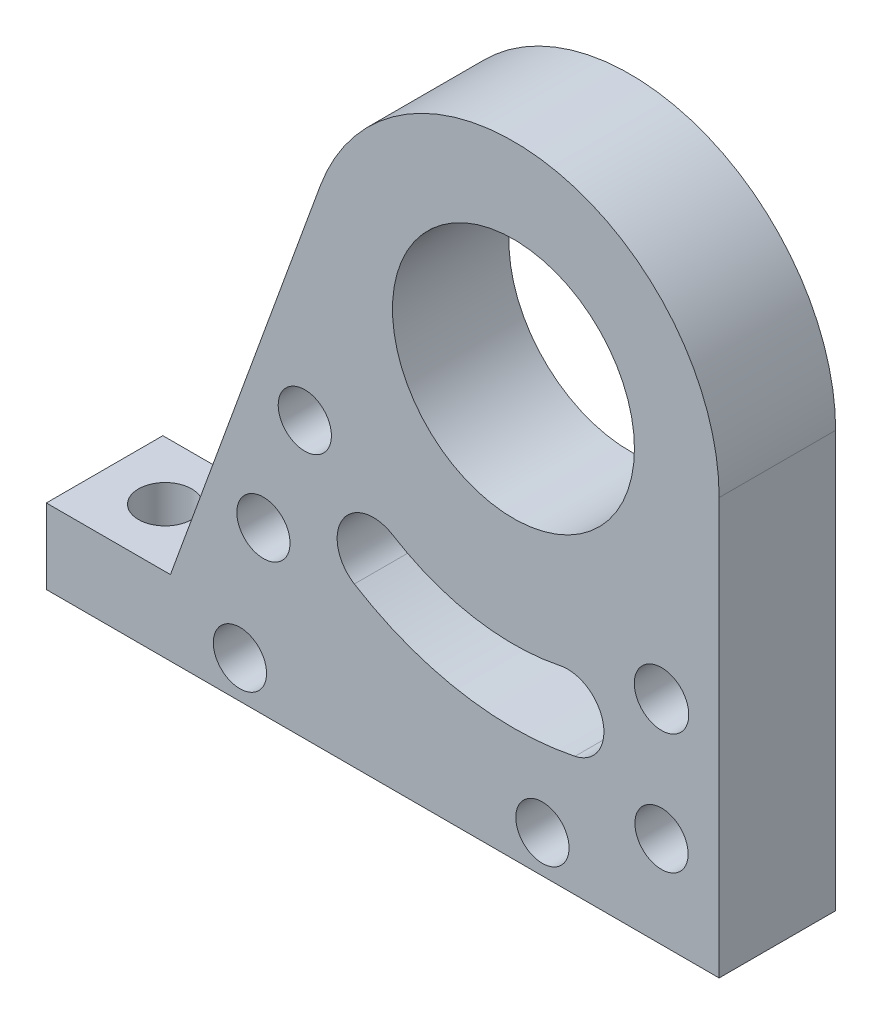
ISO-10303-21;
HEADER;
FILE_DESCRIPTION(('STEP AP214'),'2;1');
FILE_NAME('part.step','',(''),(''),'','','');
FILE_SCHEMA(('AUTOMOTIVE_DESIGN { 1 0 10303 214 1 1 1 1 }'));
ENDSEC;
DATA;
#1=APPLICATION_CONTEXT('core data for automotive mechanical design processes');
#2=APPLICATION_PROTOCOL_DEFINITION('international standard','automotive_design',2000,#1);
#3=PRODUCT_CONTEXT('',#1,'mechanical');
#4=PRODUCT('Part','Part','',(#3));
#5=PRODUCT_RELATED_PRODUCT_CATEGORY('part','',(#4));
#6=PRODUCT_DEFINITION_FORMATION('','',#4);
#7=PRODUCT_DEFINITION_CONTEXT('part definition',#1,'design');
#8=PRODUCT_DEFINITION('design','',#6,#7);
#9=PRODUCT_DEFINITION_SHAPE('','',#8);
#10=(LENGTH_UNIT() NAMED_UNIT(*) SI_UNIT(.MILLI.,.METRE.));
#11=(NAMED_UNIT(*) PLANE_ANGLE_UNIT() SI_UNIT($,.RADIAN.));
#12=(NAMED_UNIT(*) SI_UNIT($,.STERADIAN.) SOLID_ANGLE_UNIT());
#13=UNCERTAINTY_MEASURE_WITH_UNIT(LENGTH_MEASURE(1.E-05),#10,'distance_accuracy_value','');
#14=(GEOMETRIC_REPRESENTATION_CONTEXT(3) GLOBAL_UNCERTAINTY_ASSIGNED_CONTEXT((#13)) GLOBAL_UNIT_ASSIGNED_CONTEXT((#10,
#11,#12)) REPRESENTATION_CONTEXT('',''));
#15=CARTESIAN_POINT('',(0.,0.,0.));
#16=DIRECTION('',(0.,0.,1.));
#17=DIRECTION('',(1.,0.,0.));
#18=AXIS2_PLACEMENT_3D('',#15,#16,#17);
#19=CARTESIAN_POINT('',(0.,0.,9.63));
#20=DIRECTION('',(0.,0.,-1.));
#21=DIRECTION('',(-1.,0.,0.));
#22=AXIS2_PLACEMENT_3D('',#19,#20,#21);
#23=PLANE('',#22);
#24=CARTESIAN_POINT('',(-22.607305144878,-31.2882049531371,9.63));
#25=DIRECTION('',(0.,0.,1.));
#26=DIRECTION('',(1.,0.,0.));
#27=AXIS2_PLACEMENT_3D('',#24,#25,#26);
#28=CIRCLE('',#27,2.2);
#29=CARTESIAN_POINT('',(-20.407305144878,-31.2882049531371,9.63));
#30=VERTEX_POINT('',#29);
#31=EDGE_CURVE('E366',#30,#30,#28,.T.);
#32=ORIENTED_EDGE('',*,*,#31,.F.);
#33=EDGE_LOOP('',(#32));
#34=FACE_BOUND('',#33,.T.);
#35=CARTESIAN_POINT('',(2.39269485512197,-31.2882049531371,9.63));
#36=DIRECTION('',(0.,0.,1.));
#37=DIRECTION('',(1.,0.,0.));
#38=AXIS2_PLACEMENT_3D('',#35,#36,#37);
#39=CIRCLE('',#38,2.2);
#40=CARTESIAN_POINT('',(4.59269485512197,-31.2882049531371,9.63));
#41=VERTEX_POINT('',#40);
#42=EDGE_CURVE('E382',#41,#41,#39,.T.);
#43=ORIENTED_EDGE('',*,*,#42,.F.);
#44=EDGE_LOOP('',(#43));
#45=FACE_BOUND('',#44,.T.);
#46=CARTESIAN_POINT('',(4.475,-21.5400644149455,9.63));
#47=DIRECTION('',(0.,0.,1.));
#48=DIRECTION('',(-1.,0.,0.));
#49=AXIS2_PLACEMENT_3D('',#46,#47,#48);
#50=CIRCLE('',#49,3.);
#51=CARTESIAN_POINT('',(5.08522727272727,-24.4773459260744,9.63));
#52=VERTEX_POINT('',#51);
#53=CARTESIAN_POINT('',(3.86477272727273,-18.6027829038165,9.63));
#54=VERTEX_POINT('',#53);
#55=EDGE_CURVE('E160',#52,#54,#50,.T.);
#56=ORIENTED_EDGE('',*,*,#55,.F.);
#57=CARTESIAN_POINT('',(0.,0.,9.63));
#58=DIRECTION('',(0.,0.,1.));
#59=DIRECTION('',(1.,0.,0.));
#60=AXIS2_PLACEMENT_3D('',#57,#58,#59);
#61=CIRCLE('',#60,25.);
#62=CARTESIAN_POINT('',(-13.150295905069,-21.2619311824943,9.63));
#63=VERTEX_POINT('',#62);
#64=EDGE_CURVE('E164',#63,#52,#61,.T.);
#65=ORIENTED_EDGE('',*,*,#64,.F.);
#66=CARTESIAN_POINT('',(-11.5722603964607,-18.710499440595,9.63));
#67=DIRECTION('',(0.,0.,1.));
#68=DIRECTION('',(1.,0.,0.));
#69=AXIS2_PLACEMENT_3D('',#66,#67,#68);
#70=CIRCLE('',#69,3.);
#71=CARTESIAN_POINT('',(-9.99422488785245,-16.1590676986957,9.63));
#72=VERTEX_POINT('',#71);
#73=EDGE_CURVE('E156',#72,#63,#70,.T.);
#74=ORIENTED_EDGE('',*,*,#73,.F.);
#75=CARTESIAN_POINT('',(0.,0.,9.63));
#76=DIRECTION('',(0.,0.,-1.));
#77=DIRECTION('',(1.,0.,0.));
#78=AXIS2_PLACEMENT_3D('',#75,#76,#77);
#79=CIRCLE('',#78,19.);
#80=EDGE_CURVE('E53',#54,#72,#79,.T.);
#81=ORIENTED_EDGE('',*,*,#80,.F.);
#82=EDGE_LOOP('',(#56,#65,#74,#81));
#83=FACE_BOUND('',#82,.T.);
#84=CARTESIAN_POINT('',(12.2375,-26.8000824253029,9.63));
#85=DIRECTION('',(0.,0.,-1.));
#86=DIRECTION('',(-1.,0.,0.));
#87=AXIS2_PLACEMENT_3D('',#84,#85,#86);
#88=CIRCLE('',#87,2.2);
#89=CARTESIAN_POINT('',(10.0375,-26.8000824253029,9.63));
#90=VERTEX_POINT('',#89);
#91=EDGE_CURVE('E201',#90,#90,#88,.T.);
#92=ORIENTED_EDGE('',*,*,#91,.T.);
#93=EDGE_LOOP('',(#92));
#94=FACE_BOUND('',#93,.T.);
#95=CARTESIAN_POINT('',(-20.6656564791094,-20.9983681875634,9.63));
#96=DIRECTION('',(0.,0.,-1.));
#97=DIRECTION('',(-1.,0.,0.));
#98=AXIS2_PLACEMENT_3D('',#95,#96,#97);
#99=CIRCLE('',#98,2.2);
#100=CARTESIAN_POINT('',(-22.8656564791094,-20.9983681875634,9.63));
#101=VERTEX_POINT('',#100);
#102=EDGE_CURVE('E210',#101,#101,#99,.T.);
#103=ORIENTED_EDGE('',*,*,#102,.T.);
#104=EDGE_LOOP('',(#103));
#105=FACE_BOUND('',#104,.T.);
#106=CARTESIAN_POINT('',(-17.2454550458527,-11.6014419797043,9.63));
#107=DIRECTION('',(0.,0.,-1.));
#108=DIRECTION('',(-1.,0.,0.));
#109=AXIS2_PLACEMENT_3D('',#106,#107,#108);
#110=CIRCLE('',#109,2.2);
#111=CARTESIAN_POINT('',(-19.4454550458527,-11.6014419797043,9.63));
#112=VERTEX_POINT('',#111);
#113=EDGE_CURVE('E219',#112,#112,#110,.T.);
#114=ORIENTED_EDGE('',*,*,#113,.T.);
#115=EDGE_LOOP('',(#114));
#116=FACE_BOUND('',#115,.T.);
#117=CARTESIAN_POINT('',(12.2375,-16.8000824253029,9.63));
#118=DIRECTION('',(0.,0.,-1.));
#119=DIRECTION('',(-1.,0.,0.));
#120=AXIS2_PLACEMENT_3D('',#117,#118,#119);
#121=CIRCLE('',#120,2.25000000000002);
#122=CARTESIAN_POINT('',(9.98749999999998,-16.8000824253029,9.63));
#123=VERTEX_POINT('',#122);
#124=EDGE_CURVE('E202',#123,#123,#121,.T.);
#125=ORIENTED_EDGE('',*,*,#124,.T.);
#126=EDGE_LOOP('',(#125));
#127=FACE_BOUND('',#126,.T.);
#128=CARTESIAN_POINT('',(0.,0.,9.63));
#129=DIRECTION('',(0.,0.,1.));
#130=DIRECTION('',(-1.,0.,0.));
#131=AXIS2_PLACEMENT_3D('',#128,#129,#130);
#132=CIRCLE('',#131,17.);
#133=CARTESIAN_POINT('',(17.,0.,9.63));
#134=VERTEX_POINT('',#133);
#135=CARTESIAN_POINT('',(-15.9747745533604,5.81434243653638,9.63));
#136=VERTEX_POINT('',#135);
#137=EDGE_CURVE('E237',#134,#136,#132,.T.);
#138=ORIENTED_EDGE('',*,*,#137,.T.);
#139=DIRECTION('',(-0.342020143325669,-0.939692620785908,0.));
#140=VECTOR('',#139,1.);
#141=CARTESIAN_POINT('',(-15.9747745533604,5.81434243653638,9.63));
#142=LINE('',#141,#140);
#143=CARTESIAN_POINT('',(-28.3506896924276,-28.1882049531371,9.63));
#144=VERTEX_POINT('',#143);
#145=EDGE_CURVE('E241',#136,#144,#142,.T.);
#146=ORIENTED_EDGE('',*,*,#145,.T.);
#147=DIRECTION('',(-1.,0.,0.));
#148=VECTOR('',#147,1.);
#149=CARTESIAN_POINT('',(-38.607305144878,-28.1882049531371,9.63));
#150=LINE('',#149,#148);
#151=CARTESIAN_POINT('',(-38.607305144878,-28.1882049531371,9.63));
#152=VERTEX_POINT('',#151);
#153=EDGE_CURVE('E148',#144,#152,#150,.T.);
#154=ORIENTED_EDGE('',*,*,#153,.T.);
#155=DIRECTION('',(0.,-1.,0.));
#156=VECTOR('',#155,1.);
#157=CARTESIAN_POINT('',(-38.607305144878,-34.3882049531371,9.63));
#158=LINE('',#157,#156);
#159=CARTESIAN_POINT('',(-38.607305144878,-34.3882049531371,9.63));
#160=VERTEX_POINT('',#159);
#161=EDGE_CURVE('E135',#152,#160,#158,.T.);
#162=ORIENTED_EDGE('',*,*,#161,.T.);
#163=DIRECTION('',(1.,0.,0.));
#164=VECTOR('',#163,1.);
#165=CARTESIAN_POINT('',(17.,-34.3882049531371,9.63));
#166=LINE('',#165,#164);
#167=CARTESIAN_POINT('',(17.,-34.3882049531371,9.63));
#168=VERTEX_POINT('',#167);
#169=EDGE_CURVE('E246',#160,#168,#166,.T.);
#170=ORIENTED_EDGE('',*,*,#169,.T.);
#171=DIRECTION('',(0.,1.,0.));
#172=VECTOR('',#171,1.);
#173=CARTESIAN_POINT('',(17.,0.,9.63));
#174=LINE('',#173,#172);
#175=EDGE_CURVE('E249',#168,#134,#174,.T.);
#176=ORIENTED_EDGE('',*,*,#175,.T.);
#177=EDGE_LOOP('',(#138,#146,#154,#162,#170,#176));
#178=FACE_BOUND('',#177,.T.);
#179=CARTESIAN_POINT('',(0.,0.,9.63));
#180=DIRECTION('',(0.,0.,1.));
#181=DIRECTION('',(1.,0.,0.));
#182=AXIS2_PLACEMENT_3D('',#179,#180,#181);
#183=CIRCLE('',#182,10.);
#184=CARTESIAN_POINT('',(10.,0.,9.63));
#185=VERTEX_POINT('',#184);
#186=EDGE_CURVE('E229',#185,#185,#183,.T.);
#187=ORIENTED_EDGE('',*,*,#186,.F.);
#188=EDGE_LOOP('',(#187));
#189=FACE_BOUND('',#188,.T.);
#190=ADVANCED_FACE('F36',(#34,#45,#83,#94,#105,#116,#127,#178,#189),#23,.F.);
#191=CARTESIAN_POINT('',(0.,0.,0.));
#192=DIRECTION('',(0.,0.,-1.));
#193=DIRECTION('',(-1.,0.,0.));
#194=AXIS2_PLACEMENT_3D('',#191,#192,#193);
#195=PLANE('',#194);
#196=CARTESIAN_POINT('',(-22.607305144878,-31.2882049531371,0.));
#197=DIRECTION('',(0.,0.,-1.));
#198=DIRECTION('',(-1.,0.,0.));
#199=AXIS2_PLACEMENT_3D('',#196,#197,#198);
#200=CIRCLE('',#199,2.2);
#201=CARTESIAN_POINT('',(-24.807305144878,-31.2882049531371,0.));
#202=VERTEX_POINT('',#201);
#203=EDGE_CURVE('E369',#202,#202,#200,.F.);
#204=ORIENTED_EDGE('',*,*,#203,.T.);
#205=EDGE_LOOP('',(#204));
#206=FACE_BOUND('',#205,.T.);
#207=CARTESIAN_POINT('',(2.39269485512197,-31.2882049531371,0.));
#208=DIRECTION('',(0.,0.,-1.));
#209=DIRECTION('',(-1.,0.,0.));
#210=AXIS2_PLACEMENT_3D('',#207,#208,#209);
#211=CIRCLE('',#210,2.2);
#212=CARTESIAN_POINT('',(0.192694855121967,-31.2882049531371,0.));
#213=VERTEX_POINT('',#212);
#214=EDGE_CURVE('E379',#213,#213,#211,.F.);
#215=ORIENTED_EDGE('',*,*,#214,.T.);
#216=EDGE_LOOP('',(#215));
#217=FACE_BOUND('',#216,.T.);
#218=CARTESIAN_POINT('',(0.,0.,0.));
#219=DIRECTION('',(0.,0.,-1.));
#220=DIRECTION('',(-1.,0.,0.));
#221=AXIS2_PLACEMENT_3D('',#218,#219,#220);
#222=CIRCLE('',#221,25.);
#223=CARTESIAN_POINT('',(-13.150295905069,-21.2619311824943,0.));
#224=VERTEX_POINT('',#223);
#225=CARTESIAN_POINT('',(5.08522727272727,-24.4773459260744,0.));
#226=VERTEX_POINT('',#225);
#227=EDGE_CURVE('E159',#224,#226,#222,.F.);
#228=ORIENTED_EDGE('',*,*,#227,.T.);
#229=CARTESIAN_POINT('',(4.475,-21.5400644149455,0.));
#230=DIRECTION('',(0.,0.,-1.));
#231=DIRECTION('',(-1.,0.,0.));
#232=AXIS2_PLACEMENT_3D('',#229,#230,#231);
#233=CIRCLE('',#232,3.);
#234=CARTESIAN_POINT('',(3.86477272727273,-18.6027829038165,0.));
#235=VERTEX_POINT('',#234);
#236=EDGE_CURVE('E184',#226,#235,#233,.F.);
#237=ORIENTED_EDGE('',*,*,#236,.T.);
#238=CARTESIAN_POINT('',(0.,0.,0.));
#239=DIRECTION('',(0.,0.,-1.));
#240=DIRECTION('',(-1.,0.,0.));
#241=AXIS2_PLACEMENT_3D('',#238,#239,#240);
#242=CIRCLE('',#241,19.);
#243=CARTESIAN_POINT('',(-9.99422488785245,-16.1590676986957,0.));
#244=VERTEX_POINT('',#243);
#245=EDGE_CURVE('E179',#235,#244,#242,.T.);
#246=ORIENTED_EDGE('',*,*,#245,.T.);
#247=CARTESIAN_POINT('',(-11.5722603964607,-18.710499440595,0.));
#248=DIRECTION('',(0.,0.,-1.));
#249=DIRECTION('',(-1.,0.,0.));
#250=AXIS2_PLACEMENT_3D('',#247,#248,#249);
#251=CIRCLE('',#250,3.);
#252=EDGE_CURVE('E174',#244,#224,#251,.F.);
#253=ORIENTED_EDGE('',*,*,#252,.T.);
#254=EDGE_LOOP('',(#228,#237,#246,#253));
#255=FACE_BOUND('',#254,.T.);
#256=CARTESIAN_POINT('',(12.2375,-26.8000824253029,0.));
#257=DIRECTION('',(0.,0.,1.));
#258=DIRECTION('',(1.,0.,0.));
#259=AXIS2_PLACEMENT_3D('',#256,#257,#258);
#260=CIRCLE('',#259,2.2);
#261=CARTESIAN_POINT('',(14.4375,-26.8000824253029,0.));
#262=VERTEX_POINT('',#261);
#263=EDGE_CURVE('E197',#262,#262,#260,.T.);
#264=ORIENTED_EDGE('',*,*,#263,.T.);
#265=EDGE_LOOP('',(#264));
#266=FACE_BOUND('',#265,.T.);
#267=CARTESIAN_POINT('',(-20.6656564791094,-20.9983681875634,0.));
#268=DIRECTION('',(0.,0.,1.));
#269=DIRECTION('',(1.,0.,0.));
#270=AXIS2_PLACEMENT_3D('',#267,#268,#269);
#271=CIRCLE('',#270,2.2);
#272=CARTESIAN_POINT('',(-18.4656564791094,-20.9983681875634,0.));
#273=VERTEX_POINT('',#272);
#274=EDGE_CURVE('E196',#273,#273,#271,.T.);
#275=ORIENTED_EDGE('',*,*,#274,.T.);
#276=EDGE_LOOP('',(#275));
#277=FACE_BOUND('',#276,.T.);
#278=CARTESIAN_POINT('',(-17.2454550458527,-11.6014419797043,0.));
#279=DIRECTION('',(0.,0.,1.));
#280=DIRECTION('',(1.,0.,0.));
#281=AXIS2_PLACEMENT_3D('',#278,#279,#280);
#282=CIRCLE('',#281,2.2);
#283=CARTESIAN_POINT('',(-15.0454550458527,-11.6014419797043,0.));
#284=VERTEX_POINT('',#283);
#285=EDGE_CURVE('E214',#284,#284,#282,.T.);
#286=ORIENTED_EDGE('',*,*,#285,.T.);
#287=EDGE_LOOP('',(#286));
#288=FACE_BOUND('',#287,.T.);
#289=CARTESIAN_POINT('',(12.2375,-16.8000824253029,0.));
#290=DIRECTION('',(0.,0.,1.));
#291=DIRECTION('',(-1.,0.,0.));
#292=AXIS2_PLACEMENT_3D('',#289,#290,#291);
#293=CIRCLE('',#292,2.25000000000002);
#294=CARTESIAN_POINT('',(9.98749999999998,-16.8000824253029,0.));
#295=VERTEX_POINT('',#294);
#296=EDGE_CURVE('E215',#295,#295,#293,.T.);
#297=ORIENTED_EDGE('',*,*,#296,.T.);
#298=EDGE_LOOP('',(#297));
#299=FACE_BOUND('',#298,.T.);
#300=CARTESIAN_POINT('',(0.,0.,0.));
#301=DIRECTION('',(0.,0.,1.));
#302=DIRECTION('',(-1.,0.,0.));
#303=AXIS2_PLACEMENT_3D('',#300,#301,#302);
#304=CIRCLE('',#303,17.);
#305=CARTESIAN_POINT('',(17.,0.,0.));
#306=VERTEX_POINT('',#305);
#307=CARTESIAN_POINT('',(-15.9747745533604,5.81434243653638,0.));
#308=VERTEX_POINT('',#307);
#309=EDGE_CURVE('E233',#306,#308,#304,.T.);
#310=ORIENTED_EDGE('',*,*,#309,.F.);
#311=DIRECTION('',(0.,1.,0.));
#312=VECTOR('',#311,1.);
#313=CARTESIAN_POINT('',(17.,0.,0.));
#314=LINE('',#313,#312);
#315=CARTESIAN_POINT('',(17.,-34.3882049531371,0.));
#316=VERTEX_POINT('',#315);
#317=EDGE_CURVE('E242',#316,#306,#314,.T.);
#318=ORIENTED_EDGE('',*,*,#317,.F.);
#319=DIRECTION('',(1.,0.,0.));
#320=VECTOR('',#319,1.);
#321=CARTESIAN_POINT('',(17.,-34.3882049531371,0.));
#322=LINE('',#321,#320);
#323=CARTESIAN_POINT('',(-38.607305144878,-34.3882049531371,0.));
#324=VERTEX_POINT('',#323);
#325=EDGE_CURVE('E124',#324,#316,#322,.T.);
#326=ORIENTED_EDGE('',*,*,#325,.F.);
#327=DIRECTION('',(0.,-1.,0.));
#328=VECTOR('',#327,1.);
#329=CARTESIAN_POINT('',(-38.607305144878,-34.3882049531371,0.));
#330=LINE('',#329,#328);
#331=CARTESIAN_POINT('',(-38.607305144878,-28.1882049531371,0.));
#332=VERTEX_POINT('',#331);
#333=EDGE_CURVE('E115',#332,#324,#330,.T.);
#334=ORIENTED_EDGE('',*,*,#333,.F.);
#335=DIRECTION('',(-1.,0.,0.));
#336=VECTOR('',#335,1.);
#337=CARTESIAN_POINT('',(-38.607305144878,-28.1882049531371,0.));
#338=LINE('',#337,#336);
#339=CARTESIAN_POINT('',(-28.3506896924276,-28.1882049531371,0.));
#340=VERTEX_POINT('',#339);
#341=EDGE_CURVE('E121',#340,#332,#338,.T.);
#342=ORIENTED_EDGE('',*,*,#341,.F.);
#343=DIRECTION('',(-0.342020143325669,-0.939692620785908,0.));
#344=VECTOR('',#343,1.);
#345=CARTESIAN_POINT('',(-15.9747745533604,5.81434243653638,0.));
#346=LINE('',#345,#344);
#347=EDGE_CURVE('E256',#308,#340,#346,.T.);
#348=ORIENTED_EDGE('',*,*,#347,.F.);
#349=EDGE_LOOP('',(#310,#318,#326,#334,#342,#348));
#350=FACE_BOUND('',#349,.T.);
#351=CARTESIAN_POINT('',(0.,0.,0.));
#352=DIRECTION('',(0.,0.,1.));
#353=DIRECTION('',(1.,0.,0.));
#354=AXIS2_PLACEMENT_3D('',#351,#352,#353);
#355=CIRCLE('',#354,10.);
#356=CARTESIAN_POINT('',(10.,0.,0.));
#357=VERTEX_POINT('',#356);
#358=EDGE_CURVE('E206',#357,#357,#355,.T.);
#359=ORIENTED_EDGE('',*,*,#358,.T.);
#360=EDGE_LOOP('',(#359));
#361=FACE_BOUND('',#360,.T.);
#362=ADVANCED_FACE('F118',(#206,#217,#255,#266,#277,#288,#299,#350,#361),#195,.T.);
#363=CARTESIAN_POINT('',(0.,0.,9.63));
#364=DIRECTION('',(0.,0.,-1.));
#365=DIRECTION('',(-1.,0.,0.));
#366=AXIS2_PLACEMENT_3D('',#363,#364,#365);
#367=CYLINDRICAL_SURFACE('',#366,17.);
#368=ORIENTED_EDGE('',*,*,#309,.T.);
#369=DIRECTION('',(0.,0.,-1.));
#370=VECTOR('',#369,1.);
#371=CARTESIAN_POINT('',(-15.9747745533604,5.81434243653638,9.63));
#372=LINE('',#371,#370);
#373=EDGE_CURVE('E11',#136,#308,#372,.T.);
#374=ORIENTED_EDGE('',*,*,#373,.F.);
#375=ORIENTED_EDGE('',*,*,#137,.F.);
#376=DIRECTION('',(0.,0.,-1.));
#377=VECTOR('',#376,1.);
#378=CARTESIAN_POINT('',(17.,0.,9.63));
#379=LINE('',#378,#377);
#380=EDGE_CURVE('E252',#134,#306,#379,.T.);
#381=ORIENTED_EDGE('',*,*,#380,.T.);
#382=EDGE_LOOP('',(#368,#374,#375,#381));
#383=FACE_BOUND('',#382,.T.);
#384=ADVANCED_FACE('F38',(#383),#367,.T.);
#385=CARTESIAN_POINT('',(-15.9747745533604,5.81434243653638,9.63));
#386=DIRECTION('',(0.939692620785908,-0.342020143325669,0.));
#387=DIRECTION('',(0.342020143325669,0.939692620785908,0.));
#388=AXIS2_PLACEMENT_3D('',#385,#386,#387);
#389=PLANE('',#388);
#390=ORIENTED_EDGE('',*,*,#347,.T.);
#391=DIRECTION('',(0.,0.,1.));
#392=VECTOR('',#391,1.);
#393=CARTESIAN_POINT('',(-28.3506896924276,-28.1882049531371,-11.9849138728422));
#394=LINE('',#393,#392);
#395=EDGE_CURVE('E142',#340,#144,#394,.T.);
#396=ORIENTED_EDGE('',*,*,#395,.T.);
#397=ORIENTED_EDGE('',*,*,#145,.F.);
#398=ORIENTED_EDGE('',*,*,#373,.T.);
#399=EDGE_LOOP('',(#390,#396,#397,#398));
#400=FACE_BOUND('',#399,.T.);
#401=ADVANCED_FACE('F282',(#400),#389,.F.);
#402=CARTESIAN_POINT('',(17.,-34.3882049531371,9.63));
#403=DIRECTION('',(0.,1.,0.));
#404=DIRECTION('',(-1.,0.,0.));
#405=AXIS2_PLACEMENT_3D('',#402,#403,#404);
#406=PLANE('',#405);
#407=CARTESIAN_POINT('',(-33.607305144878,-34.3882049531371,4.815));
#408=DIRECTION('',(0.,-1.,0.));
#409=DIRECTION('',(1.,0.,0.));
#410=AXIS2_PLACEMENT_3D('',#407,#408,#409);
#411=CIRCLE('',#410,2.2);
#412=CARTESIAN_POINT('',(-31.407305144878,-34.3882049531371,4.815));
#413=VERTEX_POINT('',#412);
#414=EDGE_CURVE('E389',#413,#413,#411,.T.);
#415=ORIENTED_EDGE('',*,*,#414,.F.);
#416=EDGE_LOOP('',(#415));
#417=FACE_BOUND('',#416,.T.);
#418=CARTESIAN_POINT('',(-8.60730514487804,-34.3882049531371,4.815));
#419=DIRECTION('',(0.,-1.,0.));
#420=DIRECTION('',(1.,0.,0.));
#421=AXIS2_PLACEMENT_3D('',#418,#419,#420);
#422=CIRCLE('',#421,2.2);
#423=CARTESIAN_POINT('',(-6.40730514487804,-34.3882049531371,4.815));
#424=VERTEX_POINT('',#423);
#425=EDGE_CURVE('E371',#424,#424,#422,.T.);
#426=ORIENTED_EDGE('',*,*,#425,.F.);
#427=EDGE_LOOP('',(#426));
#428=FACE_BOUND('',#427,.T.);
#429=ORIENTED_EDGE('',*,*,#325,.T.);
#430=DIRECTION('',(0.,0.,-1.));
#431=VECTOR('',#430,1.);
#432=CARTESIAN_POINT('',(17.,-34.3882049531371,9.63));
#433=LINE('',#432,#431);
#434=EDGE_CURVE('E46',#168,#316,#433,.T.);
#435=ORIENTED_EDGE('',*,*,#434,.F.);
#436=ORIENTED_EDGE('',*,*,#169,.F.);
#437=DIRECTION('',(0.,0.,1.));
#438=VECTOR('',#437,1.);
#439=CARTESIAN_POINT('',(-38.607305144878,-34.3882049531371,-11.9849138728422));
#440=LINE('',#439,#438);
#441=EDGE_CURVE('E129',#324,#160,#440,.T.);
#442=ORIENTED_EDGE('',*,*,#441,.F.);
#443=EDGE_LOOP('',(#429,#435,#436,#442));
#444=FACE_BOUND('',#443,.T.);
#445=ADVANCED_FACE('F280',(#417,#428,#444),#406,.F.);
#446=CARTESIAN_POINT('',(17.,0.,9.63));
#447=DIRECTION('',(-1.,0.,0.));
#448=DIRECTION('',(0.,0.,1.));
#449=AXIS2_PLACEMENT_3D('',#446,#447,#448);
#450=PLANE('',#449);
#451=ORIENTED_EDGE('',*,*,#317,.T.);
#452=ORIENTED_EDGE('',*,*,#380,.F.);
#453=ORIENTED_EDGE('',*,*,#175,.F.);
#454=ORIENTED_EDGE('',*,*,#434,.T.);
#455=EDGE_LOOP('',(#451,#452,#453,#454));
#456=FACE_BOUND('',#455,.T.);
#457=ADVANCED_FACE('F272',(#456),#450,.F.);
#458=CARTESIAN_POINT('',(0.,0.,9.63));
#459=DIRECTION('',(0.,0.,-1.));
#460=DIRECTION('',(-1.,0.,0.));
#461=AXIS2_PLACEMENT_3D('',#458,#459,#460);
#462=CYLINDRICAL_SURFACE('',#461,10.);
#463=ORIENTED_EDGE('',*,*,#186,.T.);
#464=EDGE_LOOP('',(#463));
#465=FACE_BOUND('',#464,.T.);
#466=ORIENTED_EDGE('',*,*,#358,.F.);
#467=EDGE_LOOP('',(#466));
#468=FACE_BOUND('',#467,.T.);
#469=ADVANCED_FACE('F289',(#465,#468),#462,.F.);
#470=CARTESIAN_POINT('',(12.2375,-16.8000824253029,15.993961030679));
#471=DIRECTION('',(0.,0.,-1.));
#472=DIRECTION('',(-1.,0.,0.));
#473=AXIS2_PLACEMENT_3D('',#470,#471,#472);
#474=CYLINDRICAL_SURFACE('',#473,2.25000000000002);
#475=ORIENTED_EDGE('',*,*,#124,.F.);
#476=EDGE_LOOP('',(#475));
#477=FACE_BOUND('',#476,.T.);
#478=ORIENTED_EDGE('',*,*,#296,.F.);
#479=EDGE_LOOP('',(#478));
#480=FACE_BOUND('',#479,.T.);
#481=ADVANCED_FACE('F307',(#477,#480),#474,.F.);
#482=CARTESIAN_POINT('',(-17.2454550458527,-11.6014419797043,15.993961030679));
#483=DIRECTION('',(0.,0.,-1.));
#484=DIRECTION('',(-1.,0.,0.));
#485=AXIS2_PLACEMENT_3D('',#482,#483,#484);
#486=CYLINDRICAL_SURFACE('',#485,2.2);
#487=ORIENTED_EDGE('',*,*,#113,.F.);
#488=EDGE_LOOP('',(#487));
#489=FACE_BOUND('',#488,.T.);
#490=ORIENTED_EDGE('',*,*,#285,.F.);
#491=EDGE_LOOP('',(#490));
#492=FACE_BOUND('',#491,.T.);
#493=ADVANCED_FACE('F309',(#489,#492),#486,.F.);
#494=CARTESIAN_POINT('',(-20.6656564791094,-20.9983681875634,15.993961030679));
#495=DIRECTION('',(0.,0.,-1.));
#496=DIRECTION('',(-1.,0.,0.));
#497=AXIS2_PLACEMENT_3D('',#494,#495,#496);
#498=CYLINDRICAL_SURFACE('',#497,2.2);
#499=ORIENTED_EDGE('',*,*,#102,.F.);
#500=EDGE_LOOP('',(#499));
#501=FACE_BOUND('',#500,.T.);
#502=ORIENTED_EDGE('',*,*,#274,.F.);
#503=EDGE_LOOP('',(#502));
#504=FACE_BOUND('',#503,.T.);
#505=ADVANCED_FACE('F312',(#501,#504),#498,.F.);
#506=CARTESIAN_POINT('',(12.2375,-26.8000824253029,15.993961030679));
#507=DIRECTION('',(0.,0.,-1.));
#508=DIRECTION('',(-1.,0.,0.));
#509=AXIS2_PLACEMENT_3D('',#506,#507,#508);
#510=CYLINDRICAL_SURFACE('',#509,2.2);
#511=ORIENTED_EDGE('',*,*,#91,.F.);
#512=EDGE_LOOP('',(#511));
#513=FACE_BOUND('',#512,.T.);
#514=ORIENTED_EDGE('',*,*,#263,.F.);
#515=EDGE_LOOP('',(#514));
#516=FACE_BOUND('',#515,.T.);
#517=ADVANCED_FACE('F319',(#513,#516),#510,.F.);
#518=CARTESIAN_POINT('',(0.,0.,-23.9243915624313));
#519=DIRECTION('',(0.,0.,1.));
#520=DIRECTION('',(1.,0.,0.));
#521=AXIS2_PLACEMENT_3D('',#518,#519,#520);
#522=CYLINDRICAL_SURFACE('',#521,25.);
#523=DIRECTION('',(0.,0.,1.));
#524=VECTOR('',#523,1.);
#525=CARTESIAN_POINT('',(-13.150295905069,-21.2619311824943,-23.9243915624313));
#526=LINE('',#525,#524);
#527=EDGE_CURVE('E61',#224,#63,#526,.T.);
#528=ORIENTED_EDGE('',*,*,#527,.T.);
#529=ORIENTED_EDGE('',*,*,#64,.T.);
#530=DIRECTION('',(0.,0.,1.));
#531=VECTOR('',#530,1.);
#532=CARTESIAN_POINT('',(5.08522727272727,-24.4773459260744,-23.9243915624313));
#533=LINE('',#532,#531);
#534=EDGE_CURVE('E173',#226,#52,#533,.T.);
#535=ORIENTED_EDGE('',*,*,#534,.F.);
#536=ORIENTED_EDGE('',*,*,#227,.F.);
#537=EDGE_LOOP('',(#528,#529,#535,#536));
#538=FACE_BOUND('',#537,.T.);
#539=ADVANCED_FACE('F323',(#538),#522,.F.);
#540=CARTESIAN_POINT('',(4.475,-21.5400644149455,-23.9243915624313));
#541=DIRECTION('',(0.,0.,1.));
#542=DIRECTION('',(1.,0.,0.));
#543=AXIS2_PLACEMENT_3D('',#540,#541,#542);
#544=CYLINDRICAL_SURFACE('',#543,3.);
#545=ORIENTED_EDGE('',*,*,#534,.T.);
#546=ORIENTED_EDGE('',*,*,#55,.T.);
#547=DIRECTION('',(0.,0.,1.));
#548=VECTOR('',#547,1.);
#549=CARTESIAN_POINT('',(3.86477272727273,-18.6027829038165,-23.9243915624313));
#550=LINE('',#549,#548);
#551=EDGE_CURVE('E183',#235,#54,#550,.T.);
#552=ORIENTED_EDGE('',*,*,#551,.F.);
#553=ORIENTED_EDGE('',*,*,#236,.F.);
#554=EDGE_LOOP('',(#545,#546,#552,#553));
#555=FACE_BOUND('',#554,.T.);
#556=ADVANCED_FACE('F327',(#555),#544,.F.);
#557=CARTESIAN_POINT('',(0.,0.,-23.9243915624313));
#558=DIRECTION('',(0.,0.,1.));
#559=DIRECTION('',(1.,0.,0.));
#560=AXIS2_PLACEMENT_3D('',#557,#558,#559);
#561=CYLINDRICAL_SURFACE('',#560,19.);
#562=ORIENTED_EDGE('',*,*,#551,.T.);
#563=ORIENTED_EDGE('',*,*,#80,.T.);
#564=DIRECTION('',(0.,0.,1.));
#565=VECTOR('',#564,1.);
#566=CARTESIAN_POINT('',(-9.99422488785245,-16.1590676986957,-23.9243915624313));
#567=LINE('',#566,#565);
#568=EDGE_CURVE('E178',#244,#72,#567,.T.);
#569=ORIENTED_EDGE('',*,*,#568,.F.);
#570=ORIENTED_EDGE('',*,*,#245,.F.);
#571=EDGE_LOOP('',(#562,#563,#569,#570));
#572=FACE_BOUND('',#571,.T.);
#573=ADVANCED_FACE('F331',(#572),#561,.T.);
#574=CARTESIAN_POINT('',(-11.5722603964607,-18.710499440595,-23.9243915624313));
#575=DIRECTION('',(0.,0.,1.));
#576=DIRECTION('',(1.,0.,0.));
#577=AXIS2_PLACEMENT_3D('',#574,#575,#576);
#578=CYLINDRICAL_SURFACE('',#577,3.);
#579=ORIENTED_EDGE('',*,*,#568,.T.);
#580=ORIENTED_EDGE('',*,*,#73,.T.);
#581=ORIENTED_EDGE('',*,*,#527,.F.);
#582=ORIENTED_EDGE('',*,*,#252,.F.);
#583=EDGE_LOOP('',(#579,#580,#581,#582));
#584=FACE_BOUND('',#583,.T.);
#585=ADVANCED_FACE('F335',(#584),#578,.F.);
#586=CARTESIAN_POINT('',(-38.607305144878,-28.1882049531371,-11.9849138728422));
#587=DIRECTION('',(0.,1.,0.));
#588=DIRECTION('',(0.,0.,1.));
#589=AXIS2_PLACEMENT_3D('',#586,#587,#588);
#590=PLANE('',#589);
#591=CARTESIAN_POINT('',(-33.607305144878,-28.1882049531371,4.815));
#592=DIRECTION('',(0.,1.,0.));
#593=DIRECTION('',(0.,0.,1.));
#594=AXIS2_PLACEMENT_3D('',#591,#592,#593);
#595=CIRCLE('',#594,2.2);
#596=CARTESIAN_POINT('',(-33.607305144878,-28.1882049531371,7.015));
#597=VERTEX_POINT('',#596);
#598=EDGE_CURVE('E40',#597,#597,#595,.T.);
#599=ORIENTED_EDGE('',*,*,#598,.F.);
#600=EDGE_LOOP('',(#599));
#601=FACE_BOUND('',#600,.T.);
#602=ORIENTED_EDGE('',*,*,#395,.F.);
#603=ORIENTED_EDGE('',*,*,#341,.T.);
#604=DIRECTION('',(0.,0.,1.));
#605=VECTOR('',#604,1.);
#606=CARTESIAN_POINT('',(-38.607305144878,-28.1882049531371,-11.9849138728422));
#607=LINE('',#606,#605);
#608=EDGE_CURVE('E130',#332,#152,#607,.T.);
#609=ORIENTED_EDGE('',*,*,#608,.T.);
#610=ORIENTED_EDGE('',*,*,#153,.F.);
#611=EDGE_LOOP('',(#602,#603,#609,#610));
#612=FACE_BOUND('',#611,.T.);
#613=ADVANCED_FACE('F140',(#601,#612),#590,.T.);
#614=CARTESIAN_POINT('',(-38.607305144878,-34.3882049531371,-11.9849138728422));
#615=DIRECTION('',(-1.,0.,0.));
#616=DIRECTION('',(0.,0.,1.));
#617=AXIS2_PLACEMENT_3D('',#614,#615,#616);
#618=PLANE('',#617);
#619=ORIENTED_EDGE('',*,*,#608,.F.);
#620=ORIENTED_EDGE('',*,*,#333,.T.);
#621=ORIENTED_EDGE('',*,*,#441,.T.);
#622=ORIENTED_EDGE('',*,*,#161,.F.);
#623=EDGE_LOOP('',(#619,#620,#621,#622));
#624=FACE_BOUND('',#623,.T.);
#625=ADVANCED_FACE('F133',(#624),#618,.T.);
#626=CARTESIAN_POINT('',(-33.607305144878,-26.3882049531371,4.815));
#627=DIRECTION('',(0.,-1.,0.));
#628=DIRECTION('',(1.,0.,0.));
#629=AXIS2_PLACEMENT_3D('',#626,#627,#628);
#630=CYLINDRICAL_SURFACE('',#629,2.2);
#631=ORIENTED_EDGE('',*,*,#598,.T.);
#632=EDGE_LOOP('',(#631));
#633=FACE_BOUND('',#632,.T.);
#634=ORIENTED_EDGE('',*,*,#414,.T.);
#635=EDGE_LOOP('',(#634));
#636=FACE_BOUND('',#635,.T.);
#637=ADVANCED_FACE('F343',(#633,#636),#630,.F.);
#638=CARTESIAN_POINT('',(-8.60730514487804,-26.3882049531371,4.815));
#639=DIRECTION('',(0.,-1.,0.));
#640=DIRECTION('',(1.,0.,0.));
#641=AXIS2_PLACEMENT_3D('',#638,#639,#640);
#642=CYLINDRICAL_SURFACE('',#641,2.2);
#643=CARTESIAN_POINT('',(-8.60730514487804,-26.3882049531371,4.815));
#644=DIRECTION('',(0.,-1.,0.));
#645=DIRECTION('',(1.,0.,0.));
#646=AXIS2_PLACEMENT_3D('',#643,#644,#645);
#647=CIRCLE('',#646,2.2);
#648=CARTESIAN_POINT('',(-6.40730514487804,-26.3882049531371,4.815));
#649=VERTEX_POINT('',#648);
#650=EDGE_CURVE('E377',#649,#649,#647,.T.);
#651=ORIENTED_EDGE('',*,*,#650,.F.);
#652=EDGE_LOOP('',(#651));
#653=FACE_BOUND('',#652,.T.);
#654=ORIENTED_EDGE('',*,*,#425,.T.);
#655=EDGE_LOOP('',(#654));
#656=FACE_BOUND('',#655,.T.);
#657=ADVANCED_FACE('F344',(#653,#656),#642,.F.);
#658=CARTESIAN_POINT('',(-8.60730514487804,-26.3882049531371,4.815));
#659=DIRECTION('',(0.,-1.,0.));
#660=DIRECTION('',(1.,0.,0.));
#661=AXIS2_PLACEMENT_3D('',#658,#659,#660);
#662=PLANE('',#661);
#663=ORIENTED_EDGE('',*,*,#650,.T.);
#664=EDGE_LOOP('',(#663));
#665=FACE_BOUND('',#664,.T.);
#666=ADVANCED_FACE('F347',(#665),#662,.T.);
#667=CARTESIAN_POINT('',(2.39269485512197,-31.2882049531371,-6.22253967444162));
#668=DIRECTION('',(0.,0.,1.));
#669=DIRECTION('',(1.,0.,0.));
#670=AXIS2_PLACEMENT_3D('',#667,#668,#669);
#671=CYLINDRICAL_SURFACE('',#670,2.2);
#672=ORIENTED_EDGE('',*,*,#42,.T.);
#673=EDGE_LOOP('',(#672));
#674=FACE_BOUND('',#673,.T.);
#675=ORIENTED_EDGE('',*,*,#214,.F.);
#676=EDGE_LOOP('',(#675));
#677=FACE_BOUND('',#676,.T.);
#678=ADVANCED_FACE('F351',(#674,#677),#671,.F.);
#679=CARTESIAN_POINT('',(-22.607305144878,-31.2882049531371,-6.22253967444162));
#680=DIRECTION('',(0.,0.,1.));
#681=DIRECTION('',(1.,0.,0.));
#682=AXIS2_PLACEMENT_3D('',#679,#680,#681);
#683=CYLINDRICAL_SURFACE('',#682,2.2);
#684=ORIENTED_EDGE('',*,*,#31,.T.);
#685=EDGE_LOOP('',(#684));
#686=FACE_BOUND('',#685,.T.);
#687=ORIENTED_EDGE('',*,*,#203,.F.);
#688=EDGE_LOOP('',(#687));
#689=FACE_BOUND('',#688,.T.);
#690=ADVANCED_FACE('F358',(#686,#689),#683,.F.);
#691=CLOSED_SHELL('',(#190,#362,#384,#401,#445,#457,#469,#481,#493,#505,#517,#539,#556,#573,
#585,#613,#625,#637,#657,#666,#678,#690));
#692=MANIFOLD_SOLID_BREP('B2',#691);
#693=ADVANCED_BREP_SHAPE_REPRESENTATION('',(#18,#692),#14);
#694=SHAPE_DEFINITION_REPRESENTATION(#9,#693);
ENDSEC;
END-ISO-10303-21;
